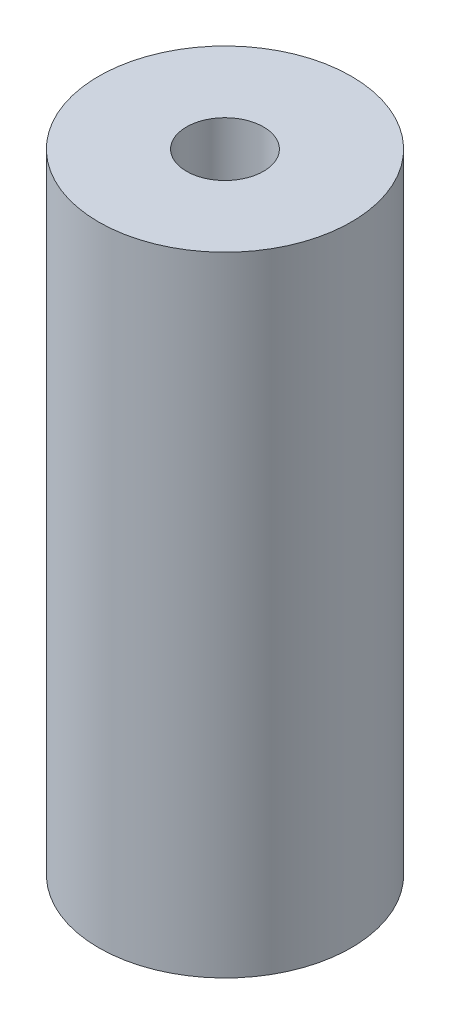
ISO-10303-21;
HEADER;
FILE_DESCRIPTION(('STEP AP214'),'2;1');
FILE_NAME('part.step','',(''),(''),'','','');
FILE_SCHEMA(('AUTOMOTIVE_DESIGN { 1 0 10303 214 1 1 1 1 }'));
ENDSEC;
DATA;
#1=APPLICATION_CONTEXT('core data for automotive mechanical design processes');
#2=APPLICATION_PROTOCOL_DEFINITION('international standard','automotive_design',2000,#1);
#3=PRODUCT_CONTEXT('',#1,'mechanical');
#4=PRODUCT('Part','Part','',(#3));
#5=PRODUCT_RELATED_PRODUCT_CATEGORY('part','',(#4));
#6=PRODUCT_DEFINITION_FORMATION('','',#4);
#7=PRODUCT_DEFINITION_CONTEXT('part definition',#1,'design');
#8=PRODUCT_DEFINITION('design','',#6,#7);
#9=PRODUCT_DEFINITION_SHAPE('','',#8);
#10=(LENGTH_UNIT() NAMED_UNIT(*) SI_UNIT(.MILLI.,.METRE.));
#11=(NAMED_UNIT(*) PLANE_ANGLE_UNIT() SI_UNIT($,.RADIAN.));
#12=(NAMED_UNIT(*) SI_UNIT($,.STERADIAN.) SOLID_ANGLE_UNIT());
#13=UNCERTAINTY_MEASURE_WITH_UNIT(LENGTH_MEASURE(1.E-05),#10,'distance_accuracy_value','');
#14=(GEOMETRIC_REPRESENTATION_CONTEXT(3) GLOBAL_UNCERTAINTY_ASSIGNED_CONTEXT((#13)) GLOBAL_UNIT_ASSIGNED_CONTEXT((#10,
#11,#12)) REPRESENTATION_CONTEXT('',''));
#15=CARTESIAN_POINT('',(0.,0.,0.));
#16=DIRECTION('',(0.,0.,1.));
#17=DIRECTION('',(1.,0.,0.));
#18=AXIS2_PLACEMENT_3D('',#15,#16,#17);
#19=CARTESIAN_POINT('',(0.,10.2,0.));
#20=DIRECTION('',(0.,1.,0.));
#21=DIRECTION('',(0.,0.,1.));
#22=AXIS2_PLACEMENT_3D('',#19,#20,#21);
#23=PLANE('',#22);
#24=CARTESIAN_POINT('',(0.,10.2,0.));
#25=DIRECTION('',(0.,1.,0.));
#26=DIRECTION('',(0.,0.,1.));
#27=AXIS2_PLACEMENT_3D('',#24,#25,#26);
#28=CIRCLE('',#27,2.05);
#29=CARTESIAN_POINT('',(0.,10.2,2.05));
#30=VERTEX_POINT('',#29);
#31=EDGE_CURVE('E10',#30,#30,#28,.T.);
#32=ORIENTED_EDGE('',*,*,#31,.T.);
#33=EDGE_LOOP('',(#32));
#34=FACE_BOUND('',#33,.T.);
#35=CARTESIAN_POINT('',(0.,10.2,0.));
#36=DIRECTION('',(0.,1.,0.));
#37=DIRECTION('',(0.,0.,1.));
#38=AXIS2_PLACEMENT_3D('',#35,#36,#37);
#39=CIRCLE('',#38,0.625);
#40=CARTESIAN_POINT('',(0.,10.2,0.625));
#41=VERTEX_POINT('',#40);
#42=EDGE_CURVE('E41',#41,#41,#39,.T.);
#43=ORIENTED_EDGE('',*,*,#42,.F.);
#44=EDGE_LOOP('',(#43));
#45=FACE_BOUND('',#44,.T.);
#46=ADVANCED_FACE('F30',(#34,#45),#23,.T.);
#47=CARTESIAN_POINT('',(0.,0.,0.));
#48=DIRECTION('',(0.,1.,0.));
#49=DIRECTION('',(0.,0.,1.));
#50=AXIS2_PLACEMENT_3D('',#47,#48,#49);
#51=PLANE('',#50);
#52=CARTESIAN_POINT('',(0.,0.,0.));
#53=DIRECTION('',(0.,1.,0.));
#54=DIRECTION('',(0.,0.,1.));
#55=AXIS2_PLACEMENT_3D('',#52,#53,#54);
#56=CIRCLE('',#55,2.05);
#57=CARTESIAN_POINT('',(0.,0.,2.05));
#58=VERTEX_POINT('',#57);
#59=EDGE_CURVE('E34',#58,#58,#56,.T.);
#60=ORIENTED_EDGE('',*,*,#59,.F.);
#61=EDGE_LOOP('',(#60));
#62=FACE_BOUND('',#61,.T.);
#63=CARTESIAN_POINT('',(0.,0.,0.));
#64=DIRECTION('',(0.,1.,0.));
#65=DIRECTION('',(0.,0.,1.));
#66=AXIS2_PLACEMENT_3D('',#63,#64,#65);
#67=CIRCLE('',#66,0.625);
#68=CARTESIAN_POINT('',(0.,0.,0.625));
#69=VERTEX_POINT('',#68);
#70=EDGE_CURVE('E43',#69,#69,#67,.T.);
#71=ORIENTED_EDGE('',*,*,#70,.T.);
#72=EDGE_LOOP('',(#71));
#73=FACE_BOUND('',#72,.T.);
#74=ADVANCED_FACE('F53',(#62,#73),#51,.F.);
#75=CARTESIAN_POINT('',(0.,10.2,0.));
#76=DIRECTION('',(0.,-1.,0.));
#77=DIRECTION('',(0.,0.,-1.));
#78=AXIS2_PLACEMENT_3D('',#75,#76,#77);
#79=CYLINDRICAL_SURFACE('',#78,2.05);
#80=ORIENTED_EDGE('',*,*,#31,.F.);
#81=EDGE_LOOP('',(#80));
#82=FACE_BOUND('',#81,.T.);
#83=ORIENTED_EDGE('',*,*,#59,.T.);
#84=EDGE_LOOP('',(#83));
#85=FACE_BOUND('',#84,.T.);
#86=ADVANCED_FACE('F32',(#82,#85),#79,.T.);
#87=CARTESIAN_POINT('',(0.,10.2,0.));
#88=DIRECTION('',(0.,-1.,0.));
#89=DIRECTION('',(0.,0.,-1.));
#90=AXIS2_PLACEMENT_3D('',#87,#88,#89);
#91=CYLINDRICAL_SURFACE('',#90,0.625);
#92=ORIENTED_EDGE('',*,*,#42,.T.);
#93=EDGE_LOOP('',(#92));
#94=FACE_BOUND('',#93,.T.);
#95=ORIENTED_EDGE('',*,*,#70,.F.);
#96=EDGE_LOOP('',(#95));
#97=FACE_BOUND('',#96,.T.);
#98=ADVANCED_FACE('F49',(#94,#97),#91,.F.);
#99=CLOSED_SHELL('',(#46,#74,#86,#98));
#100=MANIFOLD_SOLID_BREP('B2',#99);
#101=ADVANCED_BREP_SHAPE_REPRESENTATION('',(#18,#100),#14);
#102=SHAPE_DEFINITION_REPRESENTATION(#9,#101);
ENDSEC;
END-ISO-10303-21;
